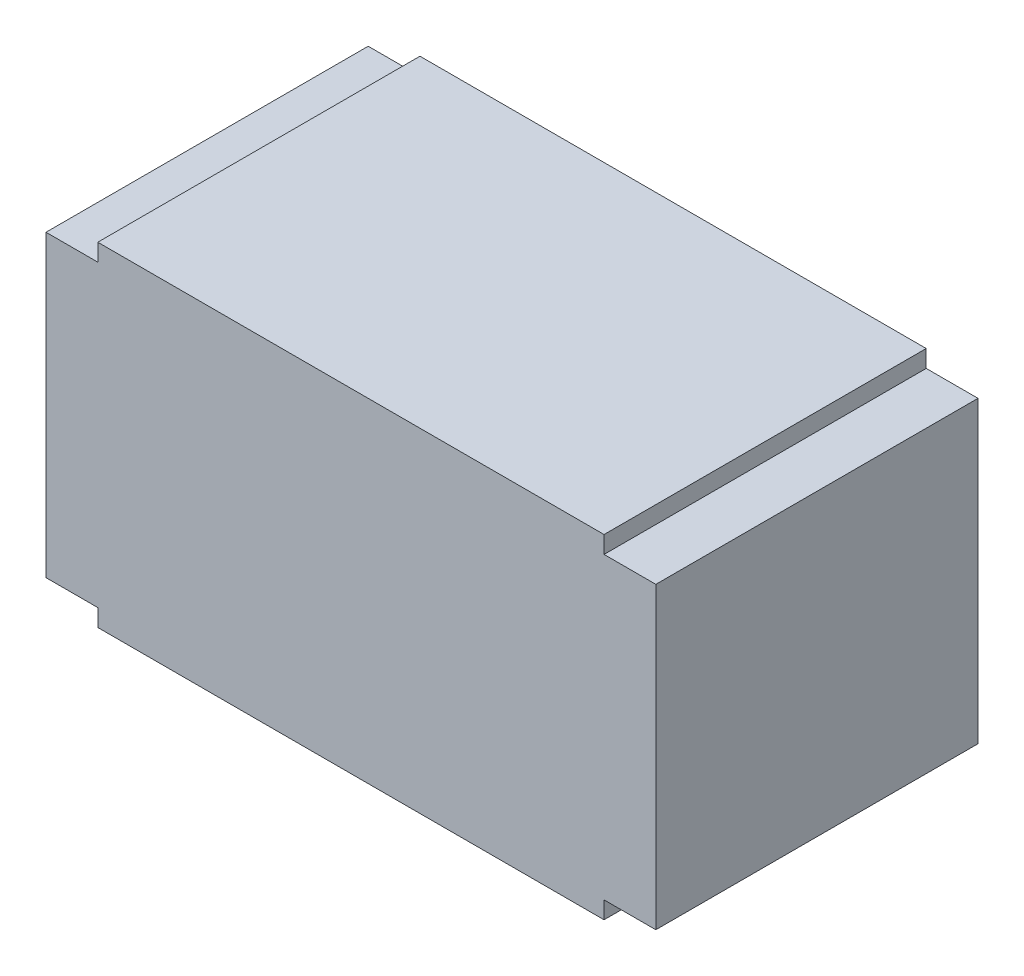
ISO-10303-21;
HEADER;
FILE_DESCRIPTION(('STEP AP214'),'2;1');
FILE_NAME('part.step','',(''),(''),'','','');
FILE_SCHEMA(('AUTOMOTIVE_DESIGN { 1 0 10303 214 1 1 1 1 }'));
ENDSEC;
DATA;
#1=APPLICATION_CONTEXT('core data for automotive mechanical design processes');
#2=APPLICATION_PROTOCOL_DEFINITION('international standard','automotive_design',2000,#1);
#3=PRODUCT_CONTEXT('',#1,'mechanical');
#4=PRODUCT('Part','Part','',(#3));
#5=PRODUCT_RELATED_PRODUCT_CATEGORY('part','',(#4));
#6=PRODUCT_DEFINITION_FORMATION('','',#4);
#7=PRODUCT_DEFINITION_CONTEXT('part definition',#1,'design');
#8=PRODUCT_DEFINITION('design','',#6,#7);
#9=PRODUCT_DEFINITION_SHAPE('','',#8);
#10=(LENGTH_UNIT() NAMED_UNIT(*) SI_UNIT(.MILLI.,.METRE.));
#11=(NAMED_UNIT(*) PLANE_ANGLE_UNIT() SI_UNIT($,.RADIAN.));
#12=(NAMED_UNIT(*) SI_UNIT($,.STERADIAN.) SOLID_ANGLE_UNIT());
#13=UNCERTAINTY_MEASURE_WITH_UNIT(LENGTH_MEASURE(1.E-05),#10,'distance_accuracy_value','');
#14=(GEOMETRIC_REPRESENTATION_CONTEXT(3) GLOBAL_UNCERTAINTY_ASSIGNED_CONTEXT((#13)) GLOBAL_UNIT_ASSIGNED_CONTEXT((#10,
#11,#12)) REPRESENTATION_CONTEXT('',''));
#15=CARTESIAN_POINT('',(0.,0.,0.));
#16=DIRECTION('',(0.,0.,1.));
#17=DIRECTION('',(1.,0.,0.));
#18=AXIS2_PLACEMENT_3D('',#15,#16,#17);
#19=CARTESIAN_POINT('',(1.1,-0.725,1.4));
#20=DIRECTION('',(0.,1.,0.));
#21=DIRECTION('',(0.,0.,1.));
#22=AXIS2_PLACEMENT_3D('',#19,#20,#21);
#23=PLANE('',#22);
#24=DIRECTION('',(1.,0.,0.));
#25=VECTOR('',#24,1.);
#26=CARTESIAN_POINT('',(1.1,-0.725,0.));
#27=LINE('',#26,#25);
#28=CARTESIAN_POINT('',(-1.1,-0.725,0.));
#29=VERTEX_POINT('',#28);
#30=CARTESIAN_POINT('',(1.1,-0.725,0.));
#31=VERTEX_POINT('',#30);
#32=EDGE_CURVE('E155',#29,#31,#27,.T.);
#33=ORIENTED_EDGE('',*,*,#32,.T.);
#34=DIRECTION('',(0.,0.,-1.));
#35=VECTOR('',#34,1.);
#36=CARTESIAN_POINT('',(1.1,-0.725,1.4));
#37=LINE('',#36,#35);
#38=CARTESIAN_POINT('',(1.1,-0.725,1.4));
#39=VERTEX_POINT('',#38);
#40=EDGE_CURVE('E11',#39,#31,#37,.T.);
#41=ORIENTED_EDGE('',*,*,#40,.F.);
#42=DIRECTION('',(1.,0.,0.));
#43=VECTOR('',#42,1.);
#44=CARTESIAN_POINT('',(1.1,-0.725,1.4));
#45=LINE('',#44,#43);
#46=CARTESIAN_POINT('',(-1.1,-0.725,1.4));
#47=VERTEX_POINT('',#46);
#48=EDGE_CURVE('E178',#47,#39,#45,.T.);
#49=ORIENTED_EDGE('',*,*,#48,.F.);
#50=DIRECTION('',(0.,0.,-1.));
#51=VECTOR('',#50,1.);
#52=CARTESIAN_POINT('',(-1.1,-0.725,1.4));
#53=LINE('',#52,#51);
#54=EDGE_CURVE('E151',#47,#29,#53,.T.);
#55=ORIENTED_EDGE('',*,*,#54,.T.);
#56=EDGE_LOOP('',(#33,#41,#49,#55));
#57=FACE_BOUND('',#56,.T.);
#58=ADVANCED_FACE('F34',(#57),#23,.F.);
#59=CARTESIAN_POINT('',(1.1,-0.65,1.4));
#60=DIRECTION('',(-1.,0.,0.));
#61=DIRECTION('',(0.,0.,1.));
#62=AXIS2_PLACEMENT_3D('',#59,#60,#61);
#63=PLANE('',#62);
#64=DIRECTION('',(0.,1.,0.));
#65=VECTOR('',#64,1.);
#66=CARTESIAN_POINT('',(1.1,-0.65,0.));
#67=LINE('',#66,#65);
#68=CARTESIAN_POINT('',(1.1,-0.65,0.));
#69=VERTEX_POINT('',#68);
#70=EDGE_CURVE('E158',#31,#69,#67,.T.);
#71=ORIENTED_EDGE('',*,*,#70,.T.);
#72=DIRECTION('',(0.,0.,-1.));
#73=VECTOR('',#72,1.);
#74=CARTESIAN_POINT('',(1.1,-0.65,1.4));
#75=LINE('',#74,#73);
#76=CARTESIAN_POINT('',(1.1,-0.65,1.4));
#77=VERTEX_POINT('',#76);
#78=EDGE_CURVE('E42',#77,#69,#75,.T.);
#79=ORIENTED_EDGE('',*,*,#78,.F.);
#80=DIRECTION('',(0.,1.,0.));
#81=VECTOR('',#80,1.);
#82=CARTESIAN_POINT('',(1.1,-0.65,1.4));
#83=LINE('',#82,#81);
#84=EDGE_CURVE('E103',#39,#77,#83,.T.);
#85=ORIENTED_EDGE('',*,*,#84,.F.);
#86=ORIENTED_EDGE('',*,*,#40,.T.);
#87=EDGE_LOOP('',(#71,#79,#85,#86));
#88=FACE_BOUND('',#87,.T.);
#89=ADVANCED_FACE('F246',(#88),#63,.F.);
#90=CARTESIAN_POINT('',(1.325,-0.65,1.4));
#91=DIRECTION('',(0.,1.,0.));
#92=DIRECTION('',(0.,0.,1.));
#93=AXIS2_PLACEMENT_3D('',#90,#91,#92);
#94=PLANE('',#93);
#95=DIRECTION('',(1.,0.,0.));
#96=VECTOR('',#95,1.);
#97=CARTESIAN_POINT('',(1.325,-0.65,0.));
#98=LINE('',#97,#96);
#99=CARTESIAN_POINT('',(1.325,-0.65,0.));
#100=VERTEX_POINT('',#99);
#101=EDGE_CURVE('E160',#69,#100,#98,.T.);
#102=ORIENTED_EDGE('',*,*,#101,.T.);
#103=DIRECTION('',(0.,0.,-1.));
#104=VECTOR('',#103,1.);
#105=CARTESIAN_POINT('',(1.325,-0.65,1.4));
#106=LINE('',#105,#104);
#107=CARTESIAN_POINT('',(1.325,-0.65,1.4));
#108=VERTEX_POINT('',#107);
#109=EDGE_CURVE('E197',#108,#100,#106,.T.);
#110=ORIENTED_EDGE('',*,*,#109,.F.);
#111=DIRECTION('',(1.,0.,0.));
#112=VECTOR('',#111,1.);
#113=CARTESIAN_POINT('',(1.325,-0.65,1.4));
#114=LINE('',#113,#112);
#115=EDGE_CURVE('E205',#77,#108,#114,.T.);
#116=ORIENTED_EDGE('',*,*,#115,.F.);
#117=ORIENTED_EDGE('',*,*,#78,.T.);
#118=EDGE_LOOP('',(#102,#110,#116,#117));
#119=FACE_BOUND('',#118,.T.);
#120=ADVANCED_FACE('F203',(#119),#94,.F.);
#121=CARTESIAN_POINT('',(1.325,0.65,1.4));
#122=DIRECTION('',(-1.,0.,0.));
#123=DIRECTION('',(0.,0.,1.));
#124=AXIS2_PLACEMENT_3D('',#121,#122,#123);
#125=PLANE('',#124);
#126=DIRECTION('',(0.,1.,0.));
#127=VECTOR('',#126,1.);
#128=CARTESIAN_POINT('',(1.325,0.65,0.));
#129=LINE('',#128,#127);
#130=CARTESIAN_POINT('',(1.325,0.65,0.));
#131=VERTEX_POINT('',#130);
#132=EDGE_CURVE('E162',#100,#131,#129,.T.);
#133=ORIENTED_EDGE('',*,*,#132,.T.);
#134=DIRECTION('',(0.,0.,-1.));
#135=VECTOR('',#134,1.);
#136=CARTESIAN_POINT('',(1.325,0.65,1.4));
#137=LINE('',#136,#135);
#138=CARTESIAN_POINT('',(1.325,0.65,1.4));
#139=VERTEX_POINT('',#138);
#140=EDGE_CURVE('E194',#139,#131,#137,.T.);
#141=ORIENTED_EDGE('',*,*,#140,.F.);
#142=DIRECTION('',(0.,1.,0.));
#143=VECTOR('',#142,1.);
#144=CARTESIAN_POINT('',(1.325,0.65,1.4));
#145=LINE('',#144,#143);
#146=EDGE_CURVE('E221',#108,#139,#145,.T.);
#147=ORIENTED_EDGE('',*,*,#146,.F.);
#148=ORIENTED_EDGE('',*,*,#109,.T.);
#149=EDGE_LOOP('',(#133,#141,#147,#148));
#150=FACE_BOUND('',#149,.T.);
#151=ADVANCED_FACE('F212',(#150),#125,.F.);
#152=CARTESIAN_POINT('',(1.1,0.65,1.4));
#153=DIRECTION('',(0.,-1.,0.));
#154=DIRECTION('',(0.,0.,-1.));
#155=AXIS2_PLACEMENT_3D('',#152,#153,#154);
#156=PLANE('',#155);
#157=DIRECTION('',(-1.,0.,0.));
#158=VECTOR('',#157,1.);
#159=CARTESIAN_POINT('',(1.1,0.65,0.));
#160=LINE('',#159,#158);
#161=CARTESIAN_POINT('',(1.1,0.65,0.));
#162=VERTEX_POINT('',#161);
#163=EDGE_CURVE('E164',#131,#162,#160,.T.);
#164=ORIENTED_EDGE('',*,*,#163,.T.);
#165=DIRECTION('',(0.,0.,-1.));
#166=VECTOR('',#165,1.);
#167=CARTESIAN_POINT('',(1.1,0.65,1.4));
#168=LINE('',#167,#166);
#169=CARTESIAN_POINT('',(1.1,0.65,1.4));
#170=VERTEX_POINT('',#169);
#171=EDGE_CURVE('E191',#170,#162,#168,.T.);
#172=ORIENTED_EDGE('',*,*,#171,.F.);
#173=DIRECTION('',(-1.,0.,0.));
#174=VECTOR('',#173,1.);
#175=CARTESIAN_POINT('',(1.1,0.65,1.4));
#176=LINE('',#175,#174);
#177=EDGE_CURVE('E218',#139,#170,#176,.T.);
#178=ORIENTED_EDGE('',*,*,#177,.F.);
#179=ORIENTED_EDGE('',*,*,#140,.T.);
#180=EDGE_LOOP('',(#164,#172,#178,#179));
#181=FACE_BOUND('',#180,.T.);
#182=ADVANCED_FACE('F216',(#181),#156,.F.);
#183=CARTESIAN_POINT('',(1.1,0.725,1.4));
#184=DIRECTION('',(-1.,0.,0.));
#185=DIRECTION('',(0.,0.,1.));
#186=AXIS2_PLACEMENT_3D('',#183,#184,#185);
#187=PLANE('',#186);
#188=DIRECTION('',(0.,1.,0.));
#189=VECTOR('',#188,1.);
#190=CARTESIAN_POINT('',(1.1,0.725,0.));
#191=LINE('',#190,#189);
#192=CARTESIAN_POINT('',(1.1,0.725,0.));
#193=VERTEX_POINT('',#192);
#194=EDGE_CURVE('E166',#162,#193,#191,.T.);
#195=ORIENTED_EDGE('',*,*,#194,.T.);
#196=DIRECTION('',(0.,0.,-1.));
#197=VECTOR('',#196,1.);
#198=CARTESIAN_POINT('',(1.1,0.725,1.4));
#199=LINE('',#198,#197);
#200=CARTESIAN_POINT('',(1.1,0.725,1.4));
#201=VERTEX_POINT('',#200);
#202=EDGE_CURVE('E188',#201,#193,#199,.T.);
#203=ORIENTED_EDGE('',*,*,#202,.F.);
#204=DIRECTION('',(0.,1.,0.));
#205=VECTOR('',#204,1.);
#206=CARTESIAN_POINT('',(1.1,0.725,1.4));
#207=LINE('',#206,#205);
#208=EDGE_CURVE('E220',#170,#201,#207,.T.);
#209=ORIENTED_EDGE('',*,*,#208,.F.);
#210=ORIENTED_EDGE('',*,*,#171,.T.);
#211=EDGE_LOOP('',(#195,#203,#209,#210));
#212=FACE_BOUND('',#211,.T.);
#213=ADVANCED_FACE('F258',(#212),#187,.F.);
#214=CARTESIAN_POINT('',(-1.1,0.725,1.4));
#215=DIRECTION('',(0.,-1.,0.));
#216=DIRECTION('',(0.,0.,-1.));
#217=AXIS2_PLACEMENT_3D('',#214,#215,#216);
#218=PLANE('',#217);
#219=DIRECTION('',(-1.,0.,0.));
#220=VECTOR('',#219,1.);
#221=CARTESIAN_POINT('',(-1.1,0.725,0.));
#222=LINE('',#221,#220);
#223=CARTESIAN_POINT('',(-1.1,0.725,0.));
#224=VERTEX_POINT('',#223);
#225=EDGE_CURVE('E168',#193,#224,#222,.T.);
#226=ORIENTED_EDGE('',*,*,#225,.T.);
#227=DIRECTION('',(0.,0.,-1.));
#228=VECTOR('',#227,1.);
#229=CARTESIAN_POINT('',(-1.1,0.725,1.4));
#230=LINE('',#229,#228);
#231=CARTESIAN_POINT('',(-1.1,0.725,1.4));
#232=VERTEX_POINT('',#231);
#233=EDGE_CURVE('E185',#232,#224,#230,.T.);
#234=ORIENTED_EDGE('',*,*,#233,.F.);
#235=DIRECTION('',(-1.,0.,0.));
#236=VECTOR('',#235,1.);
#237=CARTESIAN_POINT('',(-1.1,0.725,1.4));
#238=LINE('',#237,#236);
#239=EDGE_CURVE('E223',#201,#232,#238,.T.);
#240=ORIENTED_EDGE('',*,*,#239,.F.);
#241=ORIENTED_EDGE('',*,*,#202,.T.);
#242=EDGE_LOOP('',(#226,#234,#240,#241));
#243=FACE_BOUND('',#242,.T.);
#244=ADVANCED_FACE('F261',(#243),#218,.F.);
#245=CARTESIAN_POINT('',(-1.1,0.65,1.4));
#246=DIRECTION('',(1.,0.,0.));
#247=DIRECTION('',(0.,0.,-1.));
#248=AXIS2_PLACEMENT_3D('',#245,#246,#247);
#249=PLANE('',#248);
#250=DIRECTION('',(0.,-1.,0.));
#251=VECTOR('',#250,1.);
#252=CARTESIAN_POINT('',(-1.1,0.65,0.));
#253=LINE('',#252,#251);
#254=CARTESIAN_POINT('',(-1.1,0.65,0.));
#255=VERTEX_POINT('',#254);
#256=EDGE_CURVE('E170',#224,#255,#253,.T.);
#257=ORIENTED_EDGE('',*,*,#256,.T.);
#258=DIRECTION('',(0.,0.,-1.));
#259=VECTOR('',#258,1.);
#260=CARTESIAN_POINT('',(-1.1,0.65,1.4));
#261=LINE('',#260,#259);
#262=CARTESIAN_POINT('',(-1.1,0.65,1.4));
#263=VERTEX_POINT('',#262);
#264=EDGE_CURVE('E182',#263,#255,#261,.T.);
#265=ORIENTED_EDGE('',*,*,#264,.F.);
#266=DIRECTION('',(0.,-1.,0.));
#267=VECTOR('',#266,1.);
#268=CARTESIAN_POINT('',(-1.1,0.65,1.4));
#269=LINE('',#268,#267);
#270=EDGE_CURVE('E229',#232,#263,#269,.T.);
#271=ORIENTED_EDGE('',*,*,#270,.F.);
#272=ORIENTED_EDGE('',*,*,#233,.T.);
#273=EDGE_LOOP('',(#257,#265,#271,#272));
#274=FACE_BOUND('',#273,.T.);
#275=ADVANCED_FACE('F235',(#274),#249,.F.);
#276=CARTESIAN_POINT('',(-1.325,0.65,1.4));
#277=DIRECTION('',(0.,-1.,0.));
#278=DIRECTION('',(0.,0.,-1.));
#279=AXIS2_PLACEMENT_3D('',#276,#277,#278);
#280=PLANE('',#279);
#281=DIRECTION('',(-1.,0.,0.));
#282=VECTOR('',#281,1.);
#283=CARTESIAN_POINT('',(-1.325,0.65,0.));
#284=LINE('',#283,#282);
#285=CARTESIAN_POINT('',(-1.325,0.65,0.));
#286=VERTEX_POINT('',#285);
#287=EDGE_CURVE('E172',#255,#286,#284,.T.);
#288=ORIENTED_EDGE('',*,*,#287,.T.);
#289=DIRECTION('',(0.,0.,-1.));
#290=VECTOR('',#289,1.);
#291=CARTESIAN_POINT('',(-1.325,0.65,1.4));
#292=LINE('',#291,#290);
#293=CARTESIAN_POINT('',(-1.325,0.65,1.4));
#294=VERTEX_POINT('',#293);
#295=EDGE_CURVE('E146',#294,#286,#292,.T.);
#296=ORIENTED_EDGE('',*,*,#295,.F.);
#297=DIRECTION('',(-1.,0.,0.));
#298=VECTOR('',#297,1.);
#299=CARTESIAN_POINT('',(-1.325,0.65,1.4));
#300=LINE('',#299,#298);
#301=EDGE_CURVE('E135',#263,#294,#300,.T.);
#302=ORIENTED_EDGE('',*,*,#301,.F.);
#303=ORIENTED_EDGE('',*,*,#264,.T.);
#304=EDGE_LOOP('',(#288,#296,#302,#303));
#305=FACE_BOUND('',#304,.T.);
#306=ADVANCED_FACE('F239',(#305),#280,.F.);
#307=CARTESIAN_POINT('',(-1.325,-0.65,1.4));
#308=DIRECTION('',(1.,0.,0.));
#309=DIRECTION('',(0.,0.,-1.));
#310=AXIS2_PLACEMENT_3D('',#307,#308,#309);
#311=PLANE('',#310);
#312=DIRECTION('',(0.,-1.,0.));
#313=VECTOR('',#312,1.);
#314=CARTESIAN_POINT('',(-1.325,-0.65,0.));
#315=LINE('',#314,#313);
#316=CARTESIAN_POINT('',(-1.325,-0.65,0.));
#317=VERTEX_POINT('',#316);
#318=EDGE_CURVE('E144',#286,#317,#315,.T.);
#319=ORIENTED_EDGE('',*,*,#318,.T.);
#320=DIRECTION('',(0.,0.,-1.));
#321=VECTOR('',#320,1.);
#322=CARTESIAN_POINT('',(-1.325,-0.65,1.4));
#323=LINE('',#322,#321);
#324=CARTESIAN_POINT('',(-1.325,-0.65,1.4));
#325=VERTEX_POINT('',#324);
#326=EDGE_CURVE('E141',#325,#317,#323,.T.);
#327=ORIENTED_EDGE('',*,*,#326,.F.);
#328=DIRECTION('',(0.,-1.,0.));
#329=VECTOR('',#328,1.);
#330=CARTESIAN_POINT('',(-1.325,-0.65,1.4));
#331=LINE('',#330,#329);
#332=EDGE_CURVE('E128',#294,#325,#331,.T.);
#333=ORIENTED_EDGE('',*,*,#332,.F.);
#334=ORIENTED_EDGE('',*,*,#295,.T.);
#335=EDGE_LOOP('',(#319,#327,#333,#334));
#336=FACE_BOUND('',#335,.T.);
#337=ADVANCED_FACE('F142',(#336),#311,.F.);
#338=CARTESIAN_POINT('',(-1.1,-0.65,1.4));
#339=DIRECTION('',(0.,1.,0.));
#340=DIRECTION('',(0.,0.,1.));
#341=AXIS2_PLACEMENT_3D('',#338,#339,#340);
#342=PLANE('',#341);
#343=DIRECTION('',(1.,0.,0.));
#344=VECTOR('',#343,1.);
#345=CARTESIAN_POINT('',(-1.1,-0.65,0.));
#346=LINE('',#345,#344);
#347=CARTESIAN_POINT('',(-1.1,-0.65,0.));
#348=VERTEX_POINT('',#347);
#349=EDGE_CURVE('E175',#317,#348,#346,.T.);
#350=ORIENTED_EDGE('',*,*,#349,.T.);
#351=DIRECTION('',(0.,0.,-1.));
#352=VECTOR('',#351,1.);
#353=CARTESIAN_POINT('',(-1.1,-0.65,1.4));
#354=LINE('',#353,#352);
#355=CARTESIAN_POINT('',(-1.1,-0.65,1.4));
#356=VERTEX_POINT('',#355);
#357=EDGE_CURVE('E147',#356,#348,#354,.T.);
#358=ORIENTED_EDGE('',*,*,#357,.F.);
#359=DIRECTION('',(1.,0.,0.));
#360=VECTOR('',#359,1.);
#361=CARTESIAN_POINT('',(-1.1,-0.65,1.4));
#362=LINE('',#361,#360);
#363=EDGE_CURVE('E132',#325,#356,#362,.T.);
#364=ORIENTED_EDGE('',*,*,#363,.F.);
#365=ORIENTED_EDGE('',*,*,#326,.T.);
#366=EDGE_LOOP('',(#350,#358,#364,#365));
#367=FACE_BOUND('',#366,.T.);
#368=ADVANCED_FACE('F149',(#367),#342,.F.);
#369=CARTESIAN_POINT('',(-1.1,-0.725,1.4));
#370=DIRECTION('',(1.,0.,0.));
#371=DIRECTION('',(0.,0.,-1.));
#372=AXIS2_PLACEMENT_3D('',#369,#370,#371);
#373=PLANE('',#372);
#374=DIRECTION('',(0.,-1.,0.));
#375=VECTOR('',#374,1.);
#376=CARTESIAN_POINT('',(-1.1,-0.725,0.));
#377=LINE('',#376,#375);
#378=EDGE_CURVE('E91',#348,#29,#377,.T.);
#379=ORIENTED_EDGE('',*,*,#378,.T.);
#380=ORIENTED_EDGE('',*,*,#54,.F.);
#381=DIRECTION('',(0.,-1.,0.));
#382=VECTOR('',#381,1.);
#383=CARTESIAN_POINT('',(-1.1,-0.66,1.4));
#384=LINE('',#383,#382);
#385=EDGE_CURVE('E50',#356,#47,#384,.T.);
#386=ORIENTED_EDGE('',*,*,#385,.F.);
#387=ORIENTED_EDGE('',*,*,#357,.T.);
#388=EDGE_LOOP('',(#379,#380,#386,#387));
#389=FACE_BOUND('',#388,.T.);
#390=ADVANCED_FACE('F240',(#389),#373,.F.);
#391=CARTESIAN_POINT('',(0.,0.,1.4));
#392=DIRECTION('',(0.,0.,-1.));
#393=DIRECTION('',(-1.,0.,0.));
#394=AXIS2_PLACEMENT_3D('',#391,#392,#393);
#395=PLANE('',#394);
#396=ORIENTED_EDGE('',*,*,#48,.T.);
#397=ORIENTED_EDGE('',*,*,#84,.T.);
#398=ORIENTED_EDGE('',*,*,#115,.T.);
#399=ORIENTED_EDGE('',*,*,#146,.T.);
#400=ORIENTED_EDGE('',*,*,#177,.T.);
#401=ORIENTED_EDGE('',*,*,#208,.T.);
#402=ORIENTED_EDGE('',*,*,#239,.T.);
#403=ORIENTED_EDGE('',*,*,#270,.T.);
#404=ORIENTED_EDGE('',*,*,#301,.T.);
#405=ORIENTED_EDGE('',*,*,#332,.T.);
#406=ORIENTED_EDGE('',*,*,#363,.T.);
#407=ORIENTED_EDGE('',*,*,#385,.T.);
#408=EDGE_LOOP('',(#396,#397,#398,#399,#400,#401,#402,#403,#404,#405,#406,#407));
#409=FACE_BOUND('',#408,.T.);
#410=ADVANCED_FACE('F130',(#409),#395,.F.);
#411=CARTESIAN_POINT('',(0.,0.,0.));
#412=DIRECTION('',(0.,0.,-1.));
#413=DIRECTION('',(-1.,0.,0.));
#414=AXIS2_PLACEMENT_3D('',#411,#412,#413);
#415=PLANE('',#414);
#416=ORIENTED_EDGE('',*,*,#32,.F.);
#417=ORIENTED_EDGE('',*,*,#378,.F.);
#418=ORIENTED_EDGE('',*,*,#349,.F.);
#419=ORIENTED_EDGE('',*,*,#318,.F.);
#420=ORIENTED_EDGE('',*,*,#287,.F.);
#421=ORIENTED_EDGE('',*,*,#256,.F.);
#422=ORIENTED_EDGE('',*,*,#225,.F.);
#423=ORIENTED_EDGE('',*,*,#194,.F.);
#424=ORIENTED_EDGE('',*,*,#163,.F.);
#425=ORIENTED_EDGE('',*,*,#132,.F.);
#426=ORIENTED_EDGE('',*,*,#101,.F.);
#427=ORIENTED_EDGE('',*,*,#70,.F.);
#428=EDGE_LOOP('',(#416,#417,#418,#419,#420,#421,#422,#423,#424,#425,#426,#427));
#429=FACE_BOUND('',#428,.T.);
#430=ADVANCED_FACE('F207',(#429),#415,.T.);
#431=CLOSED_SHELL('',(#58,#89,#120,#151,#182,#213,#244,#275,#306,#337,#368,#390,#410,#430));
#432=MANIFOLD_SOLID_BREP('B2',#431);
#433=ADVANCED_BREP_SHAPE_REPRESENTATION('',(#18,#432),#14);
#434=SHAPE_DEFINITION_REPRESENTATION(#9,#433);
ENDSEC;
END-ISO-10303-21;
